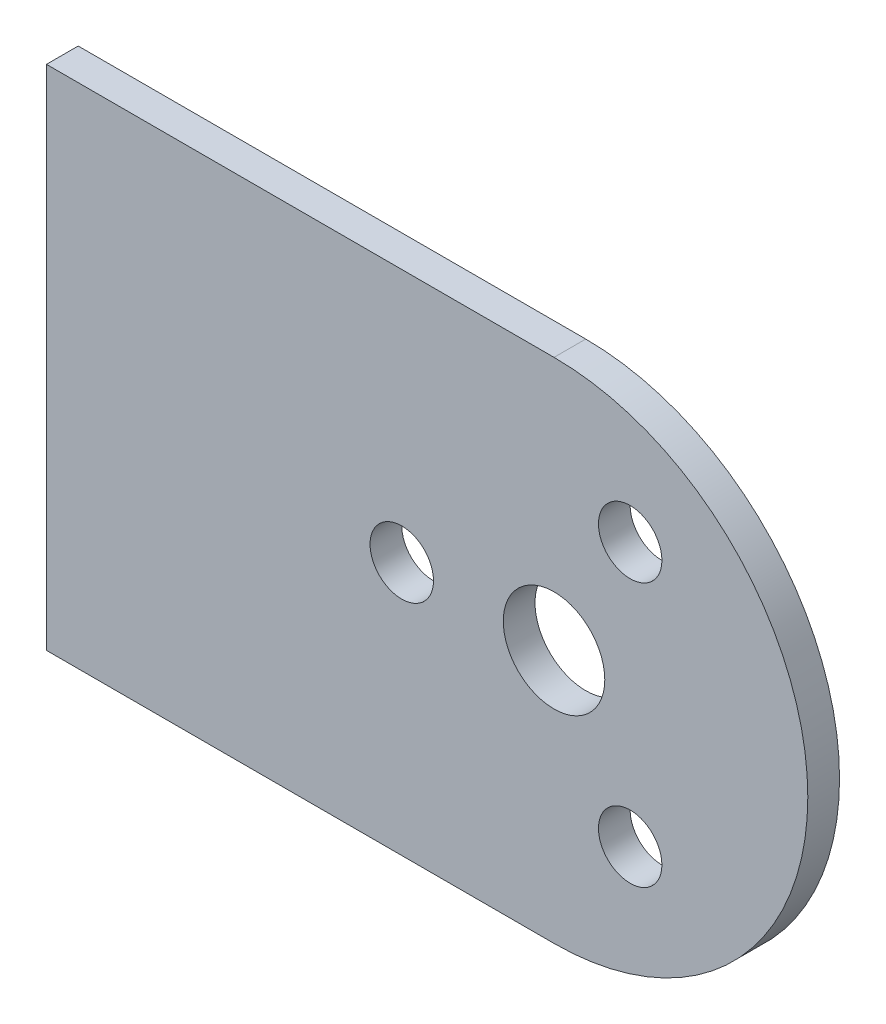
ISO-10303-21;
HEADER;
FILE_DESCRIPTION(('STEP AP214'),'2;1');
FILE_NAME('part.step','',(''),(''),'','','');
FILE_SCHEMA(('AUTOMOTIVE_DESIGN { 1 0 10303 214 1 1 1 1 }'));
ENDSEC;
DATA;
#1=APPLICATION_CONTEXT('core data for automotive mechanical design processes');
#2=APPLICATION_PROTOCOL_DEFINITION('international standard','automotive_design',2000,#1);
#3=PRODUCT_CONTEXT('',#1,'mechanical');
#4=PRODUCT('Part','Part','',(#3));
#5=PRODUCT_RELATED_PRODUCT_CATEGORY('part','',(#4));
#6=PRODUCT_DEFINITION_FORMATION('','',#4);
#7=PRODUCT_DEFINITION_CONTEXT('part definition',#1,'design');
#8=PRODUCT_DEFINITION('design','',#6,#7);
#9=PRODUCT_DEFINITION_SHAPE('','',#8);
#10=(LENGTH_UNIT() NAMED_UNIT(*) SI_UNIT(.MILLI.,.METRE.));
#11=(NAMED_UNIT(*) PLANE_ANGLE_UNIT() SI_UNIT($,.RADIAN.));
#12=(NAMED_UNIT(*) SI_UNIT($,.STERADIAN.) SOLID_ANGLE_UNIT());
#13=UNCERTAINTY_MEASURE_WITH_UNIT(LENGTH_MEASURE(1.E-05),#10,'distance_accuracy_value','');
#14=(GEOMETRIC_REPRESENTATION_CONTEXT(3) GLOBAL_UNCERTAINTY_ASSIGNED_CONTEXT((#13)) GLOBAL_UNIT_ASSIGNED_CONTEXT((#10,
#11,#12)) REPRESENTATION_CONTEXT('',''));
#15=CARTESIAN_POINT('',(0.,0.,0.));
#16=DIRECTION('',(0.,0.,1.));
#17=DIRECTION('',(1.,0.,0.));
#18=AXIS2_PLACEMENT_3D('',#15,#16,#17);
#19=CARTESIAN_POINT('',(0.,50.6132479173643,3.175));
#20=DIRECTION('',(0.,-1.,0.));
#21=DIRECTION('',(0.,0.,-1.));
#22=AXIS2_PLACEMENT_3D('',#19,#20,#21);
#23=PLANE('',#22);
#24=DIRECTION('',(-1.,0.,0.));
#25=VECTOR('',#24,1.);
#26=CARTESIAN_POINT('',(0.,50.6132479173643,0.));
#27=LINE('',#26,#25);
#28=CARTESIAN_POINT('',(22.225,50.6132479173643,0.));
#29=VERTEX_POINT('',#28);
#30=CARTESIAN_POINT('',(-28.575,50.6132479173643,0.));
#31=VERTEX_POINT('',#30);
#32=EDGE_CURVE('E109',#29,#31,#27,.T.);
#33=ORIENTED_EDGE('',*,*,#32,.F.);
#34=DIRECTION('',(0.,0.,-1.));
#35=VECTOR('',#34,1.);
#36=CARTESIAN_POINT('',(22.225,50.6132479173643,3.175));
#37=LINE('',#36,#35);
#38=CARTESIAN_POINT('',(22.225,50.6132479173643,3.175));
#39=VERTEX_POINT('',#38);
#40=EDGE_CURVE('E11',#39,#29,#37,.T.);
#41=ORIENTED_EDGE('',*,*,#40,.F.);
#42=DIRECTION('',(-1.,0.,0.));
#43=VECTOR('',#42,1.);
#44=CARTESIAN_POINT('',(0.,50.6132479173643,3.175));
#45=LINE('',#44,#43);
#46=CARTESIAN_POINT('',(-28.575,50.6132479173643,3.175));
#47=VERTEX_POINT('',#46);
#48=EDGE_CURVE('E82',#39,#47,#45,.T.);
#49=ORIENTED_EDGE('',*,*,#48,.T.);
#50=DIRECTION('',(0.,0.,-1.));
#51=VECTOR('',#50,1.);
#52=CARTESIAN_POINT('',(-28.575,50.6132479173643,3.175));
#53=LINE('',#52,#51);
#54=EDGE_CURVE('E50',#47,#31,#53,.T.);
#55=ORIENTED_EDGE('',*,*,#54,.T.);
#56=EDGE_LOOP('',(#33,#41,#49,#55));
#57=FACE_BOUND('',#56,.T.);
#58=ADVANCED_FACE('F33',(#57),#23,.T.);
#59=CARTESIAN_POINT('',(22.225,76.0132479173643,3.175));
#60=DIRECTION('',(0.,0.,-1.));
#61=DIRECTION('',(-1.,0.,0.));
#62=AXIS2_PLACEMENT_3D('',#59,#60,#61);
#63=CYLINDRICAL_SURFACE('',#62,25.4);
#64=CARTESIAN_POINT('',(22.225,76.0132479173643,0.));
#65=DIRECTION('',(0.,0.,1.));
#66=DIRECTION('',(1.,0.,0.));
#67=AXIS2_PLACEMENT_3D('',#64,#65,#66);
#68=CIRCLE('',#67,25.4);
#69=CARTESIAN_POINT('',(22.225,101.413247917364,0.));
#70=VERTEX_POINT('',#69);
#71=EDGE_CURVE('E88',#29,#70,#68,.T.);
#72=ORIENTED_EDGE('',*,*,#71,.T.);
#73=DIRECTION('',(0.,0.,-1.));
#74=VECTOR('',#73,1.);
#75=CARTESIAN_POINT('',(22.225,101.413247917364,3.175));
#76=LINE('',#75,#74);
#77=CARTESIAN_POINT('',(22.225,101.413247917364,3.175));
#78=VERTEX_POINT('',#77);
#79=EDGE_CURVE('E42',#78,#70,#76,.T.);
#80=ORIENTED_EDGE('',*,*,#79,.F.);
#81=CARTESIAN_POINT('',(22.225,76.0132479173643,3.175));
#82=DIRECTION('',(0.,0.,1.));
#83=DIRECTION('',(1.,0.,0.));
#84=AXIS2_PLACEMENT_3D('',#81,#82,#83);
#85=CIRCLE('',#84,25.4);
#86=EDGE_CURVE('E76',#39,#78,#85,.T.);
#87=ORIENTED_EDGE('',*,*,#86,.F.);
#88=ORIENTED_EDGE('',*,*,#40,.T.);
#89=EDGE_LOOP('',(#72,#80,#87,#88));
#90=FACE_BOUND('',#89,.T.);
#91=ADVANCED_FACE('F86',(#90),#63,.T.);
#92=CARTESIAN_POINT('',(0.,101.413247917364,3.175));
#93=DIRECTION('',(0.,1.,0.));
#94=DIRECTION('',(0.,0.,1.));
#95=AXIS2_PLACEMENT_3D('',#92,#93,#94);
#96=PLANE('',#95);
#97=DIRECTION('',(1.,0.,0.));
#98=VECTOR('',#97,1.);
#99=CARTESIAN_POINT('',(0.,101.413247917364,0.));
#100=LINE('',#99,#98);
#101=CARTESIAN_POINT('',(-28.575,101.413247917364,0.));
#102=VERTEX_POINT('',#101);
#103=EDGE_CURVE('E112',#102,#70,#100,.T.);
#104=ORIENTED_EDGE('',*,*,#103,.F.);
#105=DIRECTION('',(0.,0.,-1.));
#106=VECTOR('',#105,1.);
#107=CARTESIAN_POINT('',(-28.575,101.413247917364,3.175));
#108=LINE('',#107,#106);
#109=CARTESIAN_POINT('',(-28.575,101.413247917364,3.175));
#110=VERTEX_POINT('',#109);
#111=EDGE_CURVE('E63',#110,#102,#108,.T.);
#112=ORIENTED_EDGE('',*,*,#111,.F.);
#113=DIRECTION('',(1.,0.,0.));
#114=VECTOR('',#113,1.);
#115=CARTESIAN_POINT('',(0.,101.413247917364,3.175));
#116=LINE('',#115,#114);
#117=EDGE_CURVE('E81',#110,#78,#116,.T.);
#118=ORIENTED_EDGE('',*,*,#117,.T.);
#119=ORIENTED_EDGE('',*,*,#79,.T.);
#120=EDGE_LOOP('',(#104,#112,#118,#119));
#121=FACE_BOUND('',#120,.T.);
#122=ADVANCED_FACE('F91',(#121),#96,.T.);
#123=CARTESIAN_POINT('',(29.8450000000004,62.8150207636893,3.175));
#124=DIRECTION('',(0.,0.,-1.));
#125=DIRECTION('',(-1.,0.,0.));
#126=AXIS2_PLACEMENT_3D('',#123,#124,#125);
#127=CYLINDRICAL_SURFACE('',#126,3.175);
#128=CARTESIAN_POINT('',(29.8450000000004,62.8150207636893,3.175));
#129=DIRECTION('',(0.,0.,1.));
#130=DIRECTION('',(1.,0.,0.));
#131=AXIS2_PLACEMENT_3D('',#128,#129,#130);
#132=CIRCLE('',#131,3.175);
#133=CARTESIAN_POINT('',(33.0200000000004,62.8150207636893,3.175));
#134=VERTEX_POINT('',#133);
#135=EDGE_CURVE('E131',#134,#134,#132,.T.);
#136=ORIENTED_EDGE('',*,*,#135,.T.);
#137=EDGE_LOOP('',(#136));
#138=FACE_BOUND('',#137,.T.);
#139=CARTESIAN_POINT('',(29.8450000000004,62.8150207636893,0.));
#140=DIRECTION('',(0.,0.,1.));
#141=DIRECTION('',(1.,0.,0.));
#142=AXIS2_PLACEMENT_3D('',#139,#140,#141);
#143=CIRCLE('',#142,3.175);
#144=CARTESIAN_POINT('',(33.0200000000004,62.8150207636893,0.));
#145=VERTEX_POINT('',#144);
#146=EDGE_CURVE('E106',#145,#145,#143,.T.);
#147=ORIENTED_EDGE('',*,*,#146,.F.);
#148=EDGE_LOOP('',(#147));
#149=FACE_BOUND('',#148,.T.);
#150=ADVANCED_FACE('F153',(#138,#149),#127,.F.);
#151=CARTESIAN_POINT('',(29.8450000000004,89.2114750710394,3.175));
#152=DIRECTION('',(0.,0.,-1.));
#153=DIRECTION('',(-1.,0.,0.));
#154=AXIS2_PLACEMENT_3D('',#151,#152,#153);
#155=CYLINDRICAL_SURFACE('',#154,3.175);
#156=CARTESIAN_POINT('',(29.8450000000004,89.2114750710394,3.175));
#157=DIRECTION('',(0.,0.,1.));
#158=DIRECTION('',(1.,0.,0.));
#159=AXIS2_PLACEMENT_3D('',#156,#157,#158);
#160=CIRCLE('',#159,3.175);
#161=CARTESIAN_POINT('',(33.0200000000004,89.2114750710394,3.175));
#162=VERTEX_POINT('',#161);
#163=EDGE_CURVE('E126',#162,#162,#160,.T.);
#164=ORIENTED_EDGE('',*,*,#163,.T.);
#165=EDGE_LOOP('',(#164));
#166=FACE_BOUND('',#165,.T.);
#167=CARTESIAN_POINT('',(29.8450000000004,89.2114750710394,0.));
#168=DIRECTION('',(0.,0.,1.));
#169=DIRECTION('',(1.,0.,0.));
#170=AXIS2_PLACEMENT_3D('',#167,#168,#169);
#171=CIRCLE('',#170,3.175);
#172=CARTESIAN_POINT('',(33.0200000000004,89.2114750710394,0.));
#173=VERTEX_POINT('',#172);
#174=EDGE_CURVE('E103',#173,#173,#171,.T.);
#175=ORIENTED_EDGE('',*,*,#174,.F.);
#176=EDGE_LOOP('',(#175));
#177=FACE_BOUND('',#176,.T.);
#178=ADVANCED_FACE('F156',(#166,#177),#155,.F.);
#179=CARTESIAN_POINT('',(6.985,76.0132479173643,3.175));
#180=DIRECTION('',(0.,0.,-1.));
#181=DIRECTION('',(-1.,0.,0.));
#182=AXIS2_PLACEMENT_3D('',#179,#180,#181);
#183=CYLINDRICAL_SURFACE('',#182,3.175);
#184=CARTESIAN_POINT('',(6.985,76.0132479173643,3.175));
#185=DIRECTION('',(0.,0.,1.));
#186=DIRECTION('',(1.,0.,0.));
#187=AXIS2_PLACEMENT_3D('',#184,#185,#186);
#188=CIRCLE('',#187,3.175);
#189=CARTESIAN_POINT('',(10.16,76.0132479173643,3.175));
#190=VERTEX_POINT('',#189);
#191=EDGE_CURVE('E121',#190,#190,#188,.T.);
#192=ORIENTED_EDGE('',*,*,#191,.T.);
#193=EDGE_LOOP('',(#192));
#194=FACE_BOUND('',#193,.T.);
#195=CARTESIAN_POINT('',(6.985,76.0132479173643,0.));
#196=DIRECTION('',(0.,0.,1.));
#197=DIRECTION('',(1.,0.,0.));
#198=AXIS2_PLACEMENT_3D('',#195,#196,#197);
#199=CIRCLE('',#198,3.175);
#200=CARTESIAN_POINT('',(10.16,76.0132479173643,0.));
#201=VERTEX_POINT('',#200);
#202=EDGE_CURVE('E100',#201,#201,#199,.T.);
#203=ORIENTED_EDGE('',*,*,#202,.F.);
#204=EDGE_LOOP('',(#203));
#205=FACE_BOUND('',#204,.T.);
#206=ADVANCED_FACE('F143',(#194,#205),#183,.F.);
#207=CARTESIAN_POINT('',(22.225,76.0132479173643,3.175));
#208=DIRECTION('',(0.,0.,-1.));
#209=DIRECTION('',(-1.,0.,0.));
#210=AXIS2_PLACEMENT_3D('',#207,#208,#209);
#211=CYLINDRICAL_SURFACE('',#210,5.08);
#212=CARTESIAN_POINT('',(22.225,76.0132479173643,3.175));
#213=DIRECTION('',(0.,0.,1.));
#214=DIRECTION('',(1.,0.,0.));
#215=AXIS2_PLACEMENT_3D('',#212,#213,#214);
#216=CIRCLE('',#215,5.08);
#217=CARTESIAN_POINT('',(27.305,76.0132479173643,3.175));
#218=VERTEX_POINT('',#217);
#219=EDGE_CURVE('E117',#218,#218,#216,.T.);
#220=ORIENTED_EDGE('',*,*,#219,.T.);
#221=EDGE_LOOP('',(#220));
#222=FACE_BOUND('',#221,.T.);
#223=CARTESIAN_POINT('',(22.225,76.0132479173643,0.));
#224=DIRECTION('',(0.,0.,1.));
#225=DIRECTION('',(1.,0.,0.));
#226=AXIS2_PLACEMENT_3D('',#223,#224,#225);
#227=CIRCLE('',#226,5.08);
#228=CARTESIAN_POINT('',(27.305,76.0132479173643,0.));
#229=VERTEX_POINT('',#228);
#230=EDGE_CURVE('E97',#229,#229,#227,.T.);
#231=ORIENTED_EDGE('',*,*,#230,.F.);
#232=EDGE_LOOP('',(#231));
#233=FACE_BOUND('',#232,.T.);
#234=ADVANCED_FACE('F35',(#222,#233),#211,.F.);
#235=CARTESIAN_POINT('',(-28.575,0.,3.175));
#236=DIRECTION('',(-1.,0.,0.));
#237=DIRECTION('',(0.,0.,1.));
#238=AXIS2_PLACEMENT_3D('',#235,#236,#237);
#239=PLANE('',#238);
#240=DIRECTION('',(0.,1.,0.));
#241=VECTOR('',#240,1.);
#242=CARTESIAN_POINT('',(-28.575,0.,0.));
#243=LINE('',#242,#241);
#244=EDGE_CURVE('E114',#31,#102,#243,.T.);
#245=ORIENTED_EDGE('',*,*,#244,.F.);
#246=ORIENTED_EDGE('',*,*,#54,.F.);
#247=DIRECTION('',(0.,1.,0.));
#248=VECTOR('',#247,1.);
#249=CARTESIAN_POINT('',(-28.575,0.,3.175));
#250=LINE('',#249,#248);
#251=EDGE_CURVE('E92',#47,#110,#250,.T.);
#252=ORIENTED_EDGE('',*,*,#251,.T.);
#253=ORIENTED_EDGE('',*,*,#111,.T.);
#254=EDGE_LOOP('',(#245,#246,#252,#253));
#255=FACE_BOUND('',#254,.T.);
#256=ADVANCED_FACE('F133',(#255),#239,.T.);
#257=CARTESIAN_POINT('',(0.,0.,3.175));
#258=DIRECTION('',(0.,0.,1.));
#259=DIRECTION('',(1.,0.,0.));
#260=AXIS2_PLACEMENT_3D('',#257,#258,#259);
#261=PLANE('',#260);
#262=ORIENTED_EDGE('',*,*,#219,.F.);
#263=EDGE_LOOP('',(#262));
#264=FACE_BOUND('',#263,.T.);
#265=ORIENTED_EDGE('',*,*,#191,.F.);
#266=EDGE_LOOP('',(#265));
#267=FACE_BOUND('',#266,.T.);
#268=ORIENTED_EDGE('',*,*,#163,.F.);
#269=EDGE_LOOP('',(#268));
#270=FACE_BOUND('',#269,.T.);
#271=ORIENTED_EDGE('',*,*,#135,.F.);
#272=EDGE_LOOP('',(#271));
#273=FACE_BOUND('',#272,.T.);
#274=ORIENTED_EDGE('',*,*,#48,.F.);
#275=ORIENTED_EDGE('',*,*,#86,.T.);
#276=ORIENTED_EDGE('',*,*,#117,.F.);
#277=ORIENTED_EDGE('',*,*,#251,.F.);
#278=EDGE_LOOP('',(#274,#275,#276,#277));
#279=FACE_BOUND('',#278,.T.);
#280=ADVANCED_FACE('F78',(#264,#267,#270,#273,#279),#261,.T.);
#281=CARTESIAN_POINT('',(0.,0.,0.));
#282=DIRECTION('',(0.,0.,1.));
#283=DIRECTION('',(1.,0.,0.));
#284=AXIS2_PLACEMENT_3D('',#281,#282,#283);
#285=PLANE('',#284);
#286=ORIENTED_EDGE('',*,*,#230,.T.);
#287=EDGE_LOOP('',(#286));
#288=FACE_BOUND('',#287,.T.);
#289=ORIENTED_EDGE('',*,*,#202,.T.);
#290=EDGE_LOOP('',(#289));
#291=FACE_BOUND('',#290,.T.);
#292=ORIENTED_EDGE('',*,*,#174,.T.);
#293=EDGE_LOOP('',(#292));
#294=FACE_BOUND('',#293,.T.);
#295=ORIENTED_EDGE('',*,*,#146,.T.);
#296=EDGE_LOOP('',(#295));
#297=FACE_BOUND('',#296,.T.);
#298=ORIENTED_EDGE('',*,*,#32,.T.);
#299=ORIENTED_EDGE('',*,*,#244,.T.);
#300=ORIENTED_EDGE('',*,*,#103,.T.);
#301=ORIENTED_EDGE('',*,*,#71,.F.);
#302=EDGE_LOOP('',(#298,#299,#300,#301));
#303=FACE_BOUND('',#302,.T.);
#304=ADVANCED_FACE('F140',(#288,#291,#294,#297,#303),#285,.F.);
#305=CLOSED_SHELL('',(#58,#91,#122,#150,#178,#206,#234,#256,#280,#304));
#306=MANIFOLD_SOLID_BREP('B2',#305);
#307=ADVANCED_BREP_SHAPE_REPRESENTATION('',(#18,#306),#14);
#308=SHAPE_DEFINITION_REPRESENTATION(#9,#307);
ENDSEC;
END-ISO-10303-21;
